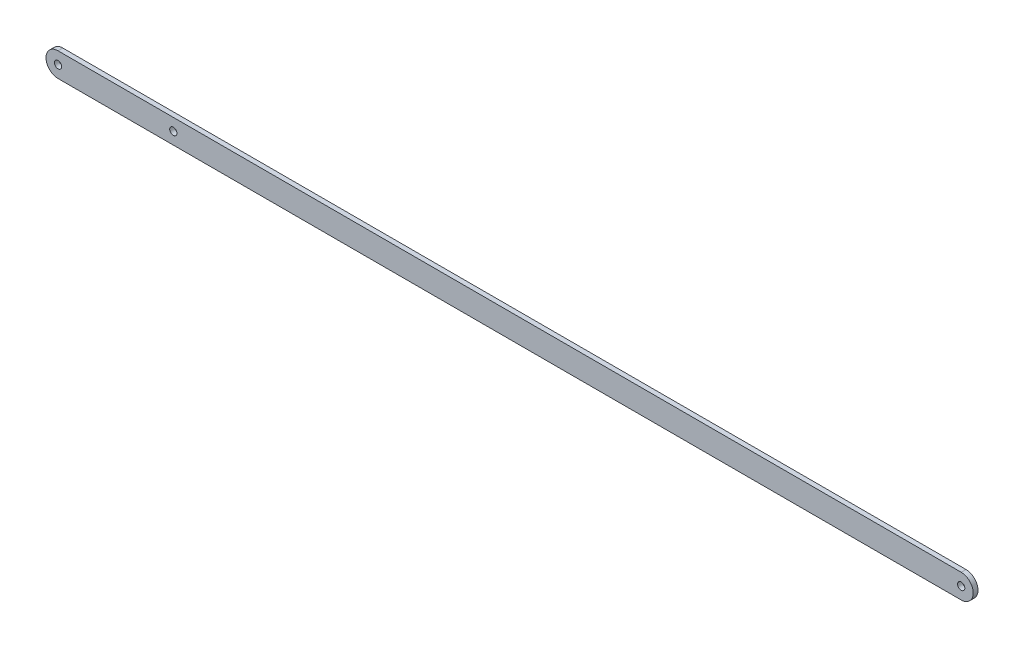
ISO-10303-21;
HEADER;
FILE_DESCRIPTION(('STEP AP214'),'2;1');
FILE_NAME('part.step','',(''),(''),'','','');
FILE_SCHEMA(('AUTOMOTIVE_DESIGN { 1 0 10303 214 1 1 1 1 }'));
ENDSEC;
DATA;
#1=APPLICATION_CONTEXT('core data for automotive mechanical design processes');
#2=APPLICATION_PROTOCOL_DEFINITION('international standard','automotive_design',2000,#1);
#3=PRODUCT_CONTEXT('',#1,'mechanical');
#4=PRODUCT('Part','Part','',(#3));
#5=PRODUCT_RELATED_PRODUCT_CATEGORY('part','',(#4));
#6=PRODUCT_DEFINITION_FORMATION('','',#4);
#7=PRODUCT_DEFINITION_CONTEXT('part definition',#1,'design');
#8=PRODUCT_DEFINITION('design','',#6,#7);
#9=PRODUCT_DEFINITION_SHAPE('','',#8);
#10=(LENGTH_UNIT() NAMED_UNIT(*) SI_UNIT(.MILLI.,.METRE.));
#11=(NAMED_UNIT(*) PLANE_ANGLE_UNIT() SI_UNIT($,.RADIAN.));
#12=(NAMED_UNIT(*) SI_UNIT($,.STERADIAN.) SOLID_ANGLE_UNIT());
#13=UNCERTAINTY_MEASURE_WITH_UNIT(LENGTH_MEASURE(1.E-05),#10,'distance_accuracy_value','');
#14=(GEOMETRIC_REPRESENTATION_CONTEXT(3) GLOBAL_UNCERTAINTY_ASSIGNED_CONTEXT((#13)) GLOBAL_UNIT_ASSIGNED_CONTEXT((#10,
#11,#12)) REPRESENTATION_CONTEXT('',''));
#15=CARTESIAN_POINT('',(0.,0.,0.));
#16=DIRECTION('',(0.,0.,1.));
#17=DIRECTION('',(1.,0.,0.));
#18=AXIS2_PLACEMENT_3D('',#15,#16,#17);
#19=CARTESIAN_POINT('',(596.9,1.79209607838327E-13,3.175));
#20=DIRECTION('',(0.,0.,1.));
#21=DIRECTION('',(1.,0.,0.));
#22=AXIS2_PLACEMENT_3D('',#19,#20,#21);
#23=PLANE('',#22);
#24=CARTESIAN_POINT('',(-444.5,0.,3.175));
#25=DIRECTION('',(0.,0.,1.));
#26=DIRECTION('',(1.,0.,0.));
#27=AXIS2_PLACEMENT_3D('',#24,#25,#26);
#28=CIRCLE('',#27,4.76250000000001);
#29=CARTESIAN_POINT('',(-439.7375,0.,3.175));
#30=VERTEX_POINT('',#29);
#31=EDGE_CURVE('E128',#30,#30,#28,.T.);
#32=ORIENTED_EDGE('',*,*,#31,.F.);
#33=EDGE_LOOP('',(#32));
#34=FACE_BOUND('',#33,.T.);
#35=CARTESIAN_POINT('',(-596.9,0.,3.175));
#36=DIRECTION('',(0.,0.,1.));
#37=DIRECTION('',(1.,0.,0.));
#38=AXIS2_PLACEMENT_3D('',#35,#36,#37);
#39=CIRCLE('',#38,4.76250000000001);
#40=CARTESIAN_POINT('',(-592.1375,0.,3.175));
#41=VERTEX_POINT('',#40);
#42=EDGE_CURVE('E104',#41,#41,#39,.T.);
#43=ORIENTED_EDGE('',*,*,#42,.F.);
#44=EDGE_LOOP('',(#43));
#45=FACE_BOUND('',#44,.T.);
#46=CARTESIAN_POINT('',(596.9,1.79209607838327E-13,3.175));
#47=DIRECTION('',(0.,0.,1.));
#48=DIRECTION('',(1.,0.,0.));
#49=AXIS2_PLACEMENT_3D('',#46,#47,#48);
#50=CIRCLE('',#49,15.875);
#51=CARTESIAN_POINT('',(596.9,-15.8750000000002,3.175));
#52=VERTEX_POINT('',#51);
#53=CARTESIAN_POINT('',(596.9,15.8749999999998,3.175));
#54=VERTEX_POINT('',#53);
#55=EDGE_CURVE('E89',#52,#54,#50,.T.);
#56=ORIENTED_EDGE('',*,*,#55,.T.);
#57=DIRECTION('',(-1.,0.,0.));
#58=VECTOR('',#57,1.);
#59=CARTESIAN_POINT('',(596.9,15.8749999999998,3.175));
#60=LINE('',#59,#58);
#61=CARTESIAN_POINT('',(-596.9,15.875,3.175));
#62=VERTEX_POINT('',#61);
#63=EDGE_CURVE('E84',#54,#62,#60,.T.);
#64=ORIENTED_EDGE('',*,*,#63,.T.);
#65=CARTESIAN_POINT('',(-596.9,0.,3.175));
#66=DIRECTION('',(0.,0.,1.));
#67=DIRECTION('',(1.,0.,0.));
#68=AXIS2_PLACEMENT_3D('',#65,#66,#67);
#69=CIRCLE('',#68,15.875);
#70=CARTESIAN_POINT('',(-596.9,-15.8750000000003,3.175));
#71=VERTEX_POINT('',#70);
#72=EDGE_CURVE('E87',#62,#71,#69,.T.);
#73=ORIENTED_EDGE('',*,*,#72,.T.);
#74=DIRECTION('',(1.,0.,0.));
#75=VECTOR('',#74,1.);
#76=CARTESIAN_POINT('',(596.9,-15.8750000000002,3.175));
#77=LINE('',#76,#75);
#78=EDGE_CURVE('E54',#71,#52,#77,.T.);
#79=ORIENTED_EDGE('',*,*,#78,.T.);
#80=EDGE_LOOP('',(#56,#64,#73,#79));
#81=FACE_BOUND('',#80,.T.);
#82=CARTESIAN_POINT('',(596.9,1.79209607838327E-13,3.175));
#83=DIRECTION('',(0.,0.,1.));
#84=DIRECTION('',(1.,0.,0.));
#85=AXIS2_PLACEMENT_3D('',#82,#83,#84);
#86=CIRCLE('',#85,4.76250000000001);
#87=CARTESIAN_POINT('',(601.6625,1.79209607838327E-13,3.175));
#88=VERTEX_POINT('',#87);
#89=EDGE_CURVE('E119',#88,#88,#86,.T.);
#90=ORIENTED_EDGE('',*,*,#89,.F.);
#91=EDGE_LOOP('',(#90));
#92=FACE_BOUND('',#91,.T.);
#93=ADVANCED_FACE('F37',(#34,#45,#81,#92),#23,.T.);
#94=CARTESIAN_POINT('',(596.9,1.79209607838327E-13,-3.175));
#95=DIRECTION('',(0.,0.,1.));
#96=DIRECTION('',(1.,0.,0.));
#97=AXIS2_PLACEMENT_3D('',#94,#95,#96);
#98=PLANE('',#97);
#99=CARTESIAN_POINT('',(-444.5,0.,-3.175));
#100=DIRECTION('',(0.,0.,1.));
#101=DIRECTION('',(1.,0.,0.));
#102=AXIS2_PLACEMENT_3D('',#99,#100,#101);
#103=CIRCLE('',#102,4.76250000000001);
#104=CARTESIAN_POINT('',(-439.7375,0.,-3.175));
#105=VERTEX_POINT('',#104);
#106=EDGE_CURVE('E125',#105,#105,#103,.T.);
#107=ORIENTED_EDGE('',*,*,#106,.T.);
#108=EDGE_LOOP('',(#107));
#109=FACE_BOUND('',#108,.T.);
#110=CARTESIAN_POINT('',(596.9,1.79209607838327E-13,-3.175));
#111=DIRECTION('',(0.,0.,1.));
#112=DIRECTION('',(1.,0.,0.));
#113=AXIS2_PLACEMENT_3D('',#110,#111,#112);
#114=CIRCLE('',#113,15.875);
#115=CARTESIAN_POINT('',(596.9,-15.8750000000002,-3.175));
#116=VERTEX_POINT('',#115);
#117=CARTESIAN_POINT('',(596.9,15.8749999999998,-3.175));
#118=VERTEX_POINT('',#117);
#119=EDGE_CURVE('E101',#116,#118,#114,.T.);
#120=ORIENTED_EDGE('',*,*,#119,.F.);
#121=DIRECTION('',(1.,0.,0.));
#122=VECTOR('',#121,1.);
#123=CARTESIAN_POINT('',(596.9,-15.8750000000002,-3.175));
#124=LINE('',#123,#122);
#125=CARTESIAN_POINT('',(-596.9,-15.8750000000003,-3.175));
#126=VERTEX_POINT('',#125);
#127=EDGE_CURVE('E77',#126,#116,#124,.T.);
#128=ORIENTED_EDGE('',*,*,#127,.F.);
#129=CARTESIAN_POINT('',(-596.9,0.,-3.175));
#130=DIRECTION('',(0.,0.,1.));
#131=DIRECTION('',(1.,0.,0.));
#132=AXIS2_PLACEMENT_3D('',#129,#130,#131);
#133=CIRCLE('',#132,15.875);
#134=CARTESIAN_POINT('',(-596.9,15.875,-3.175));
#135=VERTEX_POINT('',#134);
#136=EDGE_CURVE('E71',#135,#126,#133,.T.);
#137=ORIENTED_EDGE('',*,*,#136,.F.);
#138=DIRECTION('',(-1.,0.,0.));
#139=VECTOR('',#138,1.);
#140=CARTESIAN_POINT('',(596.9,15.8749999999998,-3.175));
#141=LINE('',#140,#139);
#142=EDGE_CURVE('E93',#118,#135,#141,.T.);
#143=ORIENTED_EDGE('',*,*,#142,.F.);
#144=EDGE_LOOP('',(#120,#128,#137,#143));
#145=FACE_BOUND('',#144,.T.);
#146=CARTESIAN_POINT('',(-596.9,0.,-3.175));
#147=DIRECTION('',(0.,0.,1.));
#148=DIRECTION('',(1.,0.,0.));
#149=AXIS2_PLACEMENT_3D('',#146,#147,#148);
#150=CIRCLE('',#149,4.76250000000001);
#151=CARTESIAN_POINT('',(-592.1375,0.,-3.175));
#152=VERTEX_POINT('',#151);
#153=EDGE_CURVE('E116',#152,#152,#150,.T.);
#154=ORIENTED_EDGE('',*,*,#153,.T.);
#155=EDGE_LOOP('',(#154));
#156=FACE_BOUND('',#155,.T.);
#157=CARTESIAN_POINT('',(596.9,1.79209607838327E-13,-3.175));
#158=DIRECTION('',(0.,0.,1.));
#159=DIRECTION('',(1.,0.,0.));
#160=AXIS2_PLACEMENT_3D('',#157,#158,#159);
#161=CIRCLE('',#160,4.76250000000001);
#162=CARTESIAN_POINT('',(601.6625,1.79209607838327E-13,-3.175));
#163=VERTEX_POINT('',#162);
#164=EDGE_CURVE('E122',#163,#163,#161,.T.);
#165=ORIENTED_EDGE('',*,*,#164,.T.);
#166=EDGE_LOOP('',(#165));
#167=FACE_BOUND('',#166,.T.);
#168=ADVANCED_FACE('F112',(#109,#145,#156,#167),#98,.F.);
#169=CARTESIAN_POINT('',(596.9,1.79209607838327E-13,3.175));
#170=DIRECTION('',(0.,0.,-1.));
#171=DIRECTION('',(-1.,0.,0.));
#172=AXIS2_PLACEMENT_3D('',#169,#170,#171);
#173=CYLINDRICAL_SURFACE('',#172,15.875);
#174=ORIENTED_EDGE('',*,*,#119,.T.);
#175=DIRECTION('',(0.,0.,-1.));
#176=VECTOR('',#175,1.);
#177=CARTESIAN_POINT('',(596.9,15.8749999999998,3.175));
#178=LINE('',#177,#176);
#179=EDGE_CURVE('E11',#54,#118,#178,.T.);
#180=ORIENTED_EDGE('',*,*,#179,.F.);
#181=ORIENTED_EDGE('',*,*,#55,.F.);
#182=DIRECTION('',(0.,0.,-1.));
#183=VECTOR('',#182,1.);
#184=CARTESIAN_POINT('',(596.9,-15.8750000000002,3.175));
#185=LINE('',#184,#183);
#186=EDGE_CURVE('E97',#52,#116,#185,.T.);
#187=ORIENTED_EDGE('',*,*,#186,.T.);
#188=EDGE_LOOP('',(#174,#180,#181,#187));
#189=FACE_BOUND('',#188,.T.);
#190=ADVANCED_FACE('F39',(#189),#173,.T.);
#191=CARTESIAN_POINT('',(596.9,15.8749999999998,3.175));
#192=DIRECTION('',(0.,-1.,0.));
#193=DIRECTION('',(1.,0.,0.));
#194=AXIS2_PLACEMENT_3D('',#191,#192,#193);
#195=PLANE('',#194);
#196=ORIENTED_EDGE('',*,*,#142,.T.);
#197=DIRECTION('',(0.,0.,-1.));
#198=VECTOR('',#197,1.);
#199=CARTESIAN_POINT('',(-596.9,15.875,3.175));
#200=LINE('',#199,#198);
#201=EDGE_CURVE('E46',#62,#135,#200,.T.);
#202=ORIENTED_EDGE('',*,*,#201,.F.);
#203=ORIENTED_EDGE('',*,*,#63,.F.);
#204=ORIENTED_EDGE('',*,*,#179,.T.);
#205=EDGE_LOOP('',(#196,#202,#203,#204));
#206=FACE_BOUND('',#205,.T.);
#207=ADVANCED_FACE('F92',(#206),#195,.F.);
#208=CARTESIAN_POINT('',(-596.9,0.,3.175));
#209=DIRECTION('',(0.,0.,-1.));
#210=DIRECTION('',(-1.,0.,0.));
#211=AXIS2_PLACEMENT_3D('',#208,#209,#210);
#212=CYLINDRICAL_SURFACE('',#211,15.875);
#213=ORIENTED_EDGE('',*,*,#136,.T.);
#214=DIRECTION('',(0.,0.,-1.));
#215=VECTOR('',#214,1.);
#216=CARTESIAN_POINT('',(-596.9,-15.8750000000003,3.175));
#217=LINE('',#216,#215);
#218=EDGE_CURVE('E94',#71,#126,#217,.T.);
#219=ORIENTED_EDGE('',*,*,#218,.F.);
#220=ORIENTED_EDGE('',*,*,#72,.F.);
#221=ORIENTED_EDGE('',*,*,#201,.T.);
#222=EDGE_LOOP('',(#213,#219,#220,#221));
#223=FACE_BOUND('',#222,.T.);
#224=ADVANCED_FACE('F95',(#223),#212,.T.);
#225=CARTESIAN_POINT('',(596.9,-15.8750000000002,3.175));
#226=DIRECTION('',(0.,1.,0.));
#227=DIRECTION('',(-1.,0.,0.));
#228=AXIS2_PLACEMENT_3D('',#225,#226,#227);
#229=PLANE('',#228);
#230=ORIENTED_EDGE('',*,*,#127,.T.);
#231=ORIENTED_EDGE('',*,*,#186,.F.);
#232=ORIENTED_EDGE('',*,*,#78,.F.);
#233=ORIENTED_EDGE('',*,*,#218,.T.);
#234=EDGE_LOOP('',(#230,#231,#232,#233));
#235=FACE_BOUND('',#234,.T.);
#236=ADVANCED_FACE('F109',(#235),#229,.F.);
#237=CARTESIAN_POINT('',(-596.9,0.,3.175));
#238=DIRECTION('',(0.,0.,-1.));
#239=DIRECTION('',(-1.,0.,0.));
#240=AXIS2_PLACEMENT_3D('',#237,#238,#239);
#241=CYLINDRICAL_SURFACE('',#240,4.76250000000001);
#242=ORIENTED_EDGE('',*,*,#42,.T.);
#243=EDGE_LOOP('',(#242));
#244=FACE_BOUND('',#243,.T.);
#245=ORIENTED_EDGE('',*,*,#153,.F.);
#246=EDGE_LOOP('',(#245));
#247=FACE_BOUND('',#246,.T.);
#248=ADVANCED_FACE('F147',(#244,#247),#241,.F.);
#249=CARTESIAN_POINT('',(596.9,1.79209607838327E-13,3.175));
#250=DIRECTION('',(0.,0.,-1.));
#251=DIRECTION('',(-1.,0.,0.));
#252=AXIS2_PLACEMENT_3D('',#249,#250,#251);
#253=CYLINDRICAL_SURFACE('',#252,4.76250000000001);
#254=ORIENTED_EDGE('',*,*,#89,.T.);
#255=EDGE_LOOP('',(#254));
#256=FACE_BOUND('',#255,.T.);
#257=ORIENTED_EDGE('',*,*,#164,.F.);
#258=EDGE_LOOP('',(#257));
#259=FACE_BOUND('',#258,.T.);
#260=ADVANCED_FACE('F138',(#256,#259),#253,.F.);
#261=CARTESIAN_POINT('',(-444.5,0.,-3.175));
#262=DIRECTION('',(0.,0.,1.));
#263=DIRECTION('',(1.,0.,0.));
#264=AXIS2_PLACEMENT_3D('',#261,#262,#263);
#265=CYLINDRICAL_SURFACE('',#264,4.76250000000001);
#266=ORIENTED_EDGE('',*,*,#106,.F.);
#267=EDGE_LOOP('',(#266));
#268=FACE_BOUND('',#267,.T.);
#269=ORIENTED_EDGE('',*,*,#31,.T.);
#270=EDGE_LOOP('',(#269));
#271=FACE_BOUND('',#270,.T.);
#272=ADVANCED_FACE('F135',(#268,#271),#265,.F.);
#273=CLOSED_SHELL('',(#93,#168,#190,#207,#224,#236,#248,#260,#272));
#274=MANIFOLD_SOLID_BREP('B2',#273);
#275=ADVANCED_BREP_SHAPE_REPRESENTATION('',(#18,#274),#14);
#276=SHAPE_DEFINITION_REPRESENTATION(#9,#275);
ENDSEC;
END-ISO-10303-21;
